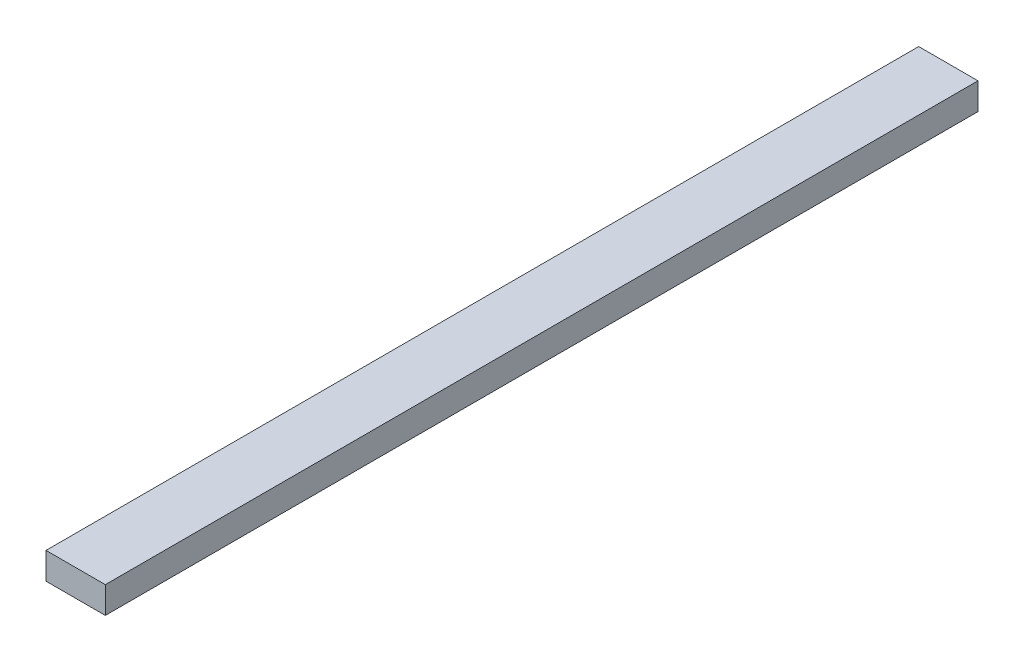
ISO-10303-21;
HEADER;
FILE_DESCRIPTION(('STEP AP214'),'2;1');
FILE_NAME('part.step','',(''),(''),'','','');
FILE_SCHEMA(('AUTOMOTIVE_DESIGN { 1 0 10303 214 1 1 1 1 }'));
ENDSEC;
DATA;
#1=APPLICATION_CONTEXT('core data for automotive mechanical design processes');
#2=APPLICATION_PROTOCOL_DEFINITION('international standard','automotive_design',2000,#1);
#3=PRODUCT_CONTEXT('',#1,'mechanical');
#4=PRODUCT('Part','Part','',(#3));
#5=PRODUCT_RELATED_PRODUCT_CATEGORY('part','',(#4));
#6=PRODUCT_DEFINITION_FORMATION('','',#4);
#7=PRODUCT_DEFINITION_CONTEXT('part definition',#1,'design');
#8=PRODUCT_DEFINITION('design','',#6,#7);
#9=PRODUCT_DEFINITION_SHAPE('','',#8);
#10=(LENGTH_UNIT() NAMED_UNIT(*) SI_UNIT(.MILLI.,.METRE.));
#11=(NAMED_UNIT(*) PLANE_ANGLE_UNIT() SI_UNIT($,.RADIAN.));
#12=(NAMED_UNIT(*) SI_UNIT($,.STERADIAN.) SOLID_ANGLE_UNIT());
#13=UNCERTAINTY_MEASURE_WITH_UNIT(LENGTH_MEASURE(1.E-05),#10,'distance_accuracy_value','');
#14=(GEOMETRIC_REPRESENTATION_CONTEXT(3) GLOBAL_UNCERTAINTY_ASSIGNED_CONTEXT((#13)) GLOBAL_UNIT_ASSIGNED_CONTEXT((#10,
#11,#12)) REPRESENTATION_CONTEXT('',''));
#15=CARTESIAN_POINT('',(0.,0.,0.));
#16=DIRECTION('',(0.,0.,1.));
#17=DIRECTION('',(1.,0.,0.));
#18=AXIS2_PLACEMENT_3D('',#15,#16,#17);
#19=CARTESIAN_POINT('',(-152.586206896552,55.603448275862,1177.));
#20=DIRECTION('',(1.,0.,0.));
#21=DIRECTION('',(0.,0.,-1.));
#22=AXIS2_PLACEMENT_3D('',#19,#20,#21);
#23=PLANE('',#22);
#24=DIRECTION('',(0.,-1.,0.));
#25=VECTOR('',#24,1.);
#26=CARTESIAN_POINT('',(-152.586206896552,55.603448275862,0.));
#27=LINE('',#26,#25);
#28=CARTESIAN_POINT('',(-152.586206896552,55.603448275862,0.));
#29=VERTEX_POINT('',#28);
#30=CARTESIAN_POINT('',(-152.586206896552,19.603448275862,0.));
#31=VERTEX_POINT('',#30);
#32=EDGE_CURVE('E102',#29,#31,#27,.T.);
#33=ORIENTED_EDGE('',*,*,#32,.T.);
#34=DIRECTION('',(0.,0.,-1.));
#35=VECTOR('',#34,1.);
#36=CARTESIAN_POINT('',(-152.586206896552,19.603448275862,1177.));
#37=LINE('',#36,#35);
#38=CARTESIAN_POINT('',(-152.586206896552,19.603448275862,1177.));
#39=VERTEX_POINT('',#38);
#40=EDGE_CURVE('E11',#39,#31,#37,.T.);
#41=ORIENTED_EDGE('',*,*,#40,.F.);
#42=DIRECTION('',(0.,-1.,0.));
#43=VECTOR('',#42,1.);
#44=CARTESIAN_POINT('',(-152.586206896552,55.603448275862,1177.));
#45=LINE('',#44,#43);
#46=CARTESIAN_POINT('',(-152.586206896552,55.603448275862,1177.));
#47=VERTEX_POINT('',#46);
#48=EDGE_CURVE('E90',#47,#39,#45,.T.);
#49=ORIENTED_EDGE('',*,*,#48,.F.);
#50=DIRECTION('',(0.,0.,-1.));
#51=VECTOR('',#50,1.);
#52=CARTESIAN_POINT('',(-152.586206896552,55.603448275862,1177.));
#53=LINE('',#52,#51);
#54=EDGE_CURVE('E98',#47,#29,#53,.T.);
#55=ORIENTED_EDGE('',*,*,#54,.T.);
#56=EDGE_LOOP('',(#33,#41,#49,#55));
#57=FACE_BOUND('',#56,.T.);
#58=ADVANCED_FACE('F39',(#57),#23,.F.);
#59=CARTESIAN_POINT('',(-152.586206896552,19.603448275862,1177.));
#60=DIRECTION('',(0.,1.,0.));
#61=DIRECTION('',(-1.,0.,0.));
#62=AXIS2_PLACEMENT_3D('',#59,#60,#61);
#63=PLANE('',#62);
#64=DIRECTION('',(1.,0.,0.));
#65=VECTOR('',#64,1.);
#66=CARTESIAN_POINT('',(-152.586206896552,19.603448275862,0.));
#67=LINE('',#66,#65);
#68=CARTESIAN_POINT('',(-72.5862068965516,19.603448275862,0.));
#69=VERTEX_POINT('',#68);
#70=EDGE_CURVE('E94',#31,#69,#67,.T.);
#71=ORIENTED_EDGE('',*,*,#70,.T.);
#72=DIRECTION('',(0.,0.,-1.));
#73=VECTOR('',#72,1.);
#74=CARTESIAN_POINT('',(-72.5862068965516,19.603448275862,1177.));
#75=LINE('',#74,#73);
#76=CARTESIAN_POINT('',(-72.5862068965516,19.603448275862,1177.));
#77=VERTEX_POINT('',#76);
#78=EDGE_CURVE('E47',#77,#69,#75,.T.);
#79=ORIENTED_EDGE('',*,*,#78,.F.);
#80=DIRECTION('',(1.,0.,0.));
#81=VECTOR('',#80,1.);
#82=CARTESIAN_POINT('',(-152.586206896552,19.603448275862,1177.));
#83=LINE('',#82,#81);
#84=EDGE_CURVE('E85',#39,#77,#83,.T.);
#85=ORIENTED_EDGE('',*,*,#84,.F.);
#86=ORIENTED_EDGE('',*,*,#40,.T.);
#87=EDGE_LOOP('',(#71,#79,#85,#86));
#88=FACE_BOUND('',#87,.T.);
#89=ADVANCED_FACE('F93',(#88),#63,.F.);
#90=CARTESIAN_POINT('',(-72.5862068965516,55.603448275862,1177.));
#91=DIRECTION('',(-1.,0.,0.));
#92=DIRECTION('',(0.,0.,1.));
#93=AXIS2_PLACEMENT_3D('',#90,#91,#92);
#94=PLANE('',#93);
#95=DIRECTION('',(0.,1.,0.));
#96=VECTOR('',#95,1.);
#97=CARTESIAN_POINT('',(-72.5862068965516,55.603448275862,0.));
#98=LINE('',#97,#96);
#99=CARTESIAN_POINT('',(-72.5862068965516,55.603448275862,0.));
#100=VERTEX_POINT('',#99);
#101=EDGE_CURVE('E72',#69,#100,#98,.T.);
#102=ORIENTED_EDGE('',*,*,#101,.T.);
#103=DIRECTION('',(0.,0.,-1.));
#104=VECTOR('',#103,1.);
#105=CARTESIAN_POINT('',(-72.5862068965516,55.603448275862,1177.));
#106=LINE('',#105,#104);
#107=CARTESIAN_POINT('',(-72.5862068965516,55.603448275862,1177.));
#108=VERTEX_POINT('',#107);
#109=EDGE_CURVE('E95',#108,#100,#106,.T.);
#110=ORIENTED_EDGE('',*,*,#109,.F.);
#111=DIRECTION('',(0.,1.,0.));
#112=VECTOR('',#111,1.);
#113=CARTESIAN_POINT('',(-72.5862068965516,55.603448275862,1177.));
#114=LINE('',#113,#112);
#115=EDGE_CURVE('E88',#77,#108,#114,.T.);
#116=ORIENTED_EDGE('',*,*,#115,.F.);
#117=ORIENTED_EDGE('',*,*,#78,.T.);
#118=EDGE_LOOP('',(#102,#110,#116,#117));
#119=FACE_BOUND('',#118,.T.);
#120=ADVANCED_FACE('F96',(#119),#94,.F.);
#121=CARTESIAN_POINT('',(-152.586206896552,55.603448275862,1177.));
#122=DIRECTION('',(0.,-1.,0.));
#123=DIRECTION('',(0.,0.,-1.));
#124=AXIS2_PLACEMENT_3D('',#121,#122,#123);
#125=PLANE('',#124);
#126=DIRECTION('',(-1.,0.,0.));
#127=VECTOR('',#126,1.);
#128=CARTESIAN_POINT('',(-152.586206896552,55.603448275862,0.));
#129=LINE('',#128,#127);
#130=EDGE_CURVE('E78',#100,#29,#129,.T.);
#131=ORIENTED_EDGE('',*,*,#130,.T.);
#132=ORIENTED_EDGE('',*,*,#54,.F.);
#133=DIRECTION('',(-1.,0.,0.));
#134=VECTOR('',#133,1.);
#135=CARTESIAN_POINT('',(-152.586206896552,55.603448275862,1177.));
#136=LINE('',#135,#134);
#137=EDGE_CURVE('E55',#108,#47,#136,.T.);
#138=ORIENTED_EDGE('',*,*,#137,.F.);
#139=ORIENTED_EDGE('',*,*,#109,.T.);
#140=EDGE_LOOP('',(#131,#132,#138,#139));
#141=FACE_BOUND('',#140,.T.);
#142=ADVANCED_FACE('F109',(#141),#125,.F.);
#143=CARTESIAN_POINT('',(0.,0.,1177.));
#144=DIRECTION('',(0.,0.,1.));
#145=DIRECTION('',(1.,0.,0.));
#146=AXIS2_PLACEMENT_3D('',#143,#144,#145);
#147=PLANE('',#146);
#148=ORIENTED_EDGE('',*,*,#48,.T.);
#149=ORIENTED_EDGE('',*,*,#84,.T.);
#150=ORIENTED_EDGE('',*,*,#115,.T.);
#151=ORIENTED_EDGE('',*,*,#137,.T.);
#152=EDGE_LOOP('',(#148,#149,#150,#151));
#153=FACE_BOUND('',#152,.T.);
#154=ADVANCED_FACE('F86',(#153),#147,.T.);
#155=CARTESIAN_POINT('',(0.,0.,0.));
#156=DIRECTION('',(0.,0.,1.));
#157=DIRECTION('',(1.,0.,0.));
#158=AXIS2_PLACEMENT_3D('',#155,#156,#157);
#159=PLANE('',#158);
#160=ORIENTED_EDGE('',*,*,#32,.F.);
#161=ORIENTED_EDGE('',*,*,#130,.F.);
#162=ORIENTED_EDGE('',*,*,#101,.F.);
#163=ORIENTED_EDGE('',*,*,#70,.F.);
#164=EDGE_LOOP('',(#160,#161,#162,#163));
#165=FACE_BOUND('',#164,.T.);
#166=ADVANCED_FACE('F112',(#165),#159,.F.);
#167=CLOSED_SHELL('',(#58,#89,#120,#142,#154,#166));
#168=MANIFOLD_SOLID_BREP('B2',#167);
#169=ADVANCED_BREP_SHAPE_REPRESENTATION('',(#18,#168),#14);
#170=SHAPE_DEFINITION_REPRESENTATION(#9,#169);
ENDSEC;
END-ISO-10303-21;
